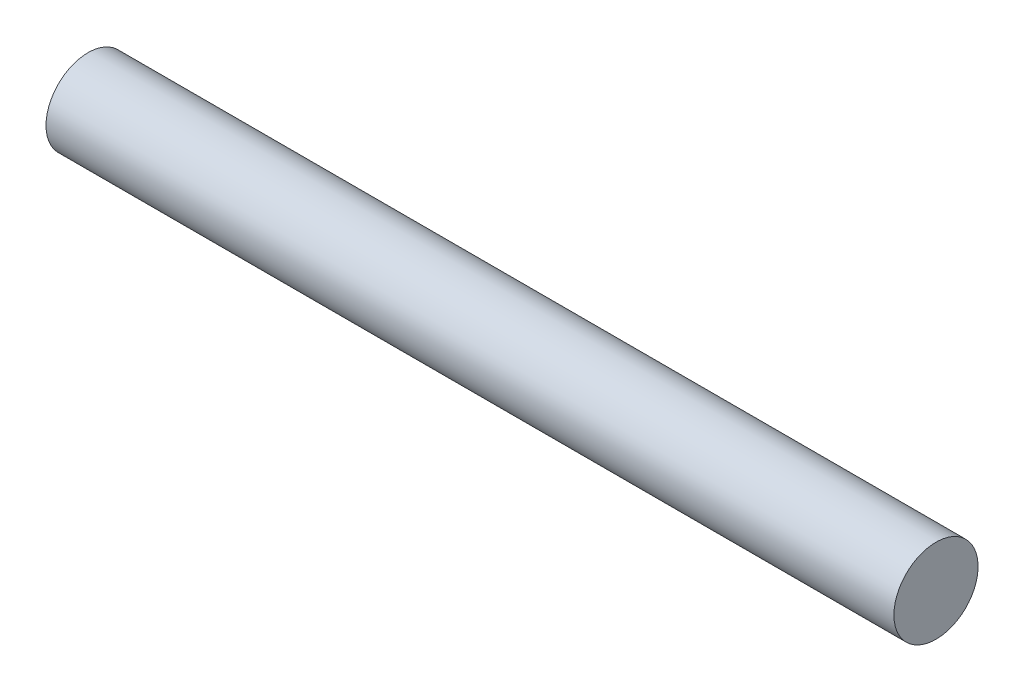
ISO-10303-21;
HEADER;
FILE_DESCRIPTION(('STEP AP214'),'2;1');
FILE_NAME('part.step','',(''),(''),'','','');
FILE_SCHEMA(('AUTOMOTIVE_DESIGN { 1 0 10303 214 1 1 1 1 }'));
ENDSEC;
DATA;
#1=APPLICATION_CONTEXT('core data for automotive mechanical design processes');
#2=APPLICATION_PROTOCOL_DEFINITION('international standard','automotive_design',2000,#1);
#3=PRODUCT_CONTEXT('',#1,'mechanical');
#4=PRODUCT('Part','Part','',(#3));
#5=PRODUCT_RELATED_PRODUCT_CATEGORY('part','',(#4));
#6=PRODUCT_DEFINITION_FORMATION('','',#4);
#7=PRODUCT_DEFINITION_CONTEXT('part definition',#1,'design');
#8=PRODUCT_DEFINITION('design','',#6,#7);
#9=PRODUCT_DEFINITION_SHAPE('','',#8);
#10=(LENGTH_UNIT() NAMED_UNIT(*) SI_UNIT(.MILLI.,.METRE.));
#11=(NAMED_UNIT(*) PLANE_ANGLE_UNIT() SI_UNIT($,.RADIAN.));
#12=(NAMED_UNIT(*) SI_UNIT($,.STERADIAN.) SOLID_ANGLE_UNIT());
#13=UNCERTAINTY_MEASURE_WITH_UNIT(LENGTH_MEASURE(1.E-05),#10,'distance_accuracy_value','');
#14=(GEOMETRIC_REPRESENTATION_CONTEXT(3) GLOBAL_UNCERTAINTY_ASSIGNED_CONTEXT((#13)) GLOBAL_UNIT_ASSIGNED_CONTEXT((#10,
#11,#12)) REPRESENTATION_CONTEXT('',''));
#15=CARTESIAN_POINT('',(0.,0.,0.));
#16=DIRECTION('',(0.,0.,1.));
#17=DIRECTION('',(1.,0.,0.));
#18=AXIS2_PLACEMENT_3D('',#15,#16,#17);
#19=CARTESIAN_POINT('',(60.26,0.,0.));
#20=DIRECTION('',(-1.,0.,0.));
#21=DIRECTION('',(0.,0.,1.));
#22=AXIS2_PLACEMENT_3D('',#19,#20,#21);
#23=CYLINDRICAL_SURFACE('',#22,2.99);
#24=CARTESIAN_POINT('',(60.26,0.,0.));
#25=DIRECTION('',(1.,0.,0.));
#26=DIRECTION('',(0.,0.,-1.));
#27=AXIS2_PLACEMENT_3D('',#24,#25,#26);
#28=CIRCLE('',#27,2.99);
#29=CARTESIAN_POINT('',(60.26,0.,2.99));
#30=VERTEX_POINT('',#29);
#31=EDGE_CURVE('E10',#30,#30,#28,.T.);
#32=CARTESIAN_POINT('',(0.,0.,0.));
#33=DIRECTION('',(1.,0.,0.));
#34=DIRECTION('',(0.,0.,-1.));
#35=AXIS2_PLACEMENT_3D('',#32,#33,#34);
#36=CIRCLE('',#35,2.99);
#37=CARTESIAN_POINT('',(0.,0.,2.99));
#38=VERTEX_POINT('',#37);
#39=EDGE_CURVE('E35',#38,#38,#36,.T.);
#40=CARTESIAN_POINT('',(60.26,0.,2.99));
#41=CARTESIAN_POINT('',(59.6322916666667,0.,2.99));
#42=CARTESIAN_POINT('',(59.0045833333333,0.,2.99));
#43=CARTESIAN_POINT('',(57.7491666666667,0.,2.99));
#44=CARTESIAN_POINT('',(57.1214583333333,0.,2.99));
#45=CARTESIAN_POINT('',(55.8660416666667,0.,2.99));
#46=CARTESIAN_POINT('',(55.2383333333333,0.,2.99));
#47=CARTESIAN_POINT('',(53.9829166666667,0.,2.99));
#48=CARTESIAN_POINT('',(53.3552083333333,0.,2.99));
#49=CARTESIAN_POINT('',(52.0997916666667,0.,2.99));
#50=CARTESIAN_POINT('',(51.4720833333333,0.,2.99));
#51=CARTESIAN_POINT('',(50.2166666666667,0.,2.99));
#52=CARTESIAN_POINT('',(49.5889583333333,0.,2.99));
#53=CARTESIAN_POINT('',(48.3335416666667,0.,2.99));
#54=CARTESIAN_POINT('',(47.7058333333333,0.,2.99));
#55=CARTESIAN_POINT('',(46.4504166666667,0.,2.99));
#56=CARTESIAN_POINT('',(45.8227083333333,0.,2.99));
#57=CARTESIAN_POINT('',(44.5672916666667,0.,2.99));
#58=CARTESIAN_POINT('',(43.9395833333333,0.,2.99));
#59=CARTESIAN_POINT('',(42.6841666666667,0.,2.99));
#60=CARTESIAN_POINT('',(42.0564583333333,0.,2.99));
#61=CARTESIAN_POINT('',(40.8010416666667,0.,2.99));
#62=CARTESIAN_POINT('',(40.1733333333333,0.,2.99));
#63=CARTESIAN_POINT('',(38.9179166666667,0.,2.99));
#64=CARTESIAN_POINT('',(38.2902083333333,0.,2.99));
#65=CARTESIAN_POINT('',(37.0347916666667,0.,2.99));
#66=CARTESIAN_POINT('',(36.4070833333333,0.,2.99));
#67=CARTESIAN_POINT('',(35.1516666666667,0.,2.99));
#68=CARTESIAN_POINT('',(34.5239583333333,0.,2.99));
#69=CARTESIAN_POINT('',(33.2685416666667,0.,2.99));
#70=CARTESIAN_POINT('',(32.6408333333333,0.,2.99));
#71=CARTESIAN_POINT('',(31.3854166666667,0.,2.99));
#72=CARTESIAN_POINT('',(30.7577083333333,0.,2.99));
#73=CARTESIAN_POINT('',(29.5022916666667,0.,2.99));
#74=CARTESIAN_POINT('',(28.8745833333333,0.,2.99));
#75=CARTESIAN_POINT('',(27.6191666666667,0.,2.99));
#76=CARTESIAN_POINT('',(26.9914583333333,0.,2.99));
#77=CARTESIAN_POINT('',(25.7360416666667,0.,2.99));
#78=CARTESIAN_POINT('',(25.1083333333333,0.,2.99));
#79=CARTESIAN_POINT('',(23.8529166666667,0.,2.99));
#80=CARTESIAN_POINT('',(23.2252083333333,0.,2.99));
#81=CARTESIAN_POINT('',(21.9697916666667,0.,2.99));
#82=CARTESIAN_POINT('',(21.3420833333333,0.,2.99));
#83=CARTESIAN_POINT('',(20.0866666666667,0.,2.99));
#84=CARTESIAN_POINT('',(19.4589583333333,0.,2.99));
#85=CARTESIAN_POINT('',(18.2035416666667,0.,2.99));
#86=CARTESIAN_POINT('',(17.5758333333333,0.,2.99));
#87=CARTESIAN_POINT('',(16.3204166666667,0.,2.99));
#88=CARTESIAN_POINT('',(15.6927083333333,0.,2.99));
#89=CARTESIAN_POINT('',(14.4372916666667,0.,2.99));
#90=CARTESIAN_POINT('',(13.8095833333333,0.,2.99));
#91=CARTESIAN_POINT('',(12.5541666666667,0.,2.99));
#92=CARTESIAN_POINT('',(11.9264583333333,0.,2.99));
#93=CARTESIAN_POINT('',(10.6710416666667,0.,2.99));
#94=CARTESIAN_POINT('',(10.0433333333333,0.,2.99));
#95=CARTESIAN_POINT('',(8.78791666666667,0.,2.99));
#96=CARTESIAN_POINT('',(8.16020833333333,0.,2.99));
#97=CARTESIAN_POINT('',(6.90479166666666,0.,2.99));
#98=CARTESIAN_POINT('',(6.27708333333333,0.,2.99));
#99=CARTESIAN_POINT('',(5.02166666666666,0.,2.99));
#100=CARTESIAN_POINT('',(4.39395833333333,0.,2.99));
#101=CARTESIAN_POINT('',(3.13854166666667,0.,2.99));
#102=CARTESIAN_POINT('',(2.51083333333333,0.,2.99));
#103=CARTESIAN_POINT('',(1.25541666666667,0.,2.99));
#104=CARTESIAN_POINT('',(0.627708333333333,0.,2.99));
#105=CARTESIAN_POINT('',(0.,0.,2.99));
#106=B_SPLINE_CURVE_WITH_KNOTS('',3,(#40,#41,#42,#43,#44,#45,#46,#47,#48,#49,#50,#51,#52,#53,
#54,#55,#56,#57,#58,#59,#60,#61,#62,#63,#64,#65,#66,#67,#68,#69,#70,#71,#72,#73,#74,#75,#76,#77,
#78,#79,#80,#81,#82,#83,#84,#85,#86,#87,#88,#89,#90,#91,#92,#93,#94,#95,#96,#97,#98,#99,#100,
#101,#102,#103,#104,#105),.UNSPECIFIED.,.F.,.F.,(4,2,2,2,2,2,2,2,2,2,2,2,2,2,2,2,2,2,2,2,2,2,2,
2,2,2,2,2,2,2,2,2,4),(0.,1.88312500000001,3.76625000000001,5.64937500000001,7.5325,9.415625,
11.29875,13.181875,15.065,16.948125,18.83125,20.714375,22.5975,24.480625,26.36375,28.246875,
30.13,32.013125,33.89625,35.779375,37.6625,39.545625,41.42875,43.311875,45.195,47.078125,
48.96125,50.844375,52.7275,54.610625,56.49375,58.376875,60.26),.UNSPECIFIED.);
#107=EDGE_CURVE('BSEAM32',#30,#38,#106,.T.);
#108=ORIENTED_EDGE('',*,*,#31,.F.);
#109=ORIENTED_EDGE('',*,*,#39,.T.);
#110=ORIENTED_EDGE('',*,*,#107,.T.);
#111=ORIENTED_EDGE('',*,*,#107,.F.);
#112=EDGE_LOOP('',(#108,#110,#109,#111));
#113=FACE_BOUND('',#112,.T.);
#114=ADVANCED_FACE('F32',(#113),#23,.T.);
#115=CARTESIAN_POINT('',(60.26,0.,0.));
#116=DIRECTION('',(1.,0.,0.));
#117=DIRECTION('',(0.,0.,-1.));
#118=AXIS2_PLACEMENT_3D('',#115,#116,#117);
#119=PLANE('',#118);
#120=ORIENTED_EDGE('',*,*,#31,.T.);
#121=EDGE_LOOP('',(#120));
#122=FACE_BOUND('',#121,.T.);
#123=ADVANCED_FACE('F47',(#122),#119,.T.);
#124=CARTESIAN_POINT('',(0.,0.,0.));
#125=DIRECTION('',(1.,0.,0.));
#126=DIRECTION('',(0.,0.,-1.));
#127=AXIS2_PLACEMENT_3D('',#124,#125,#126);
#128=PLANE('',#127);
#129=ORIENTED_EDGE('',*,*,#39,.F.);
#130=EDGE_LOOP('',(#129));
#131=FACE_BOUND('',#130,.T.);
#132=ADVANCED_FACE('F45',(#131),#128,.F.);
#133=CLOSED_SHELL('',(#114,#123,#132));
#134=MANIFOLD_SOLID_BREP('B2',#133);
#135=ADVANCED_BREP_SHAPE_REPRESENTATION('',(#18,#134),#14);
#136=SHAPE_DEFINITION_REPRESENTATION(#9,#135);
ENDSEC;
END-ISO-10303-21;
